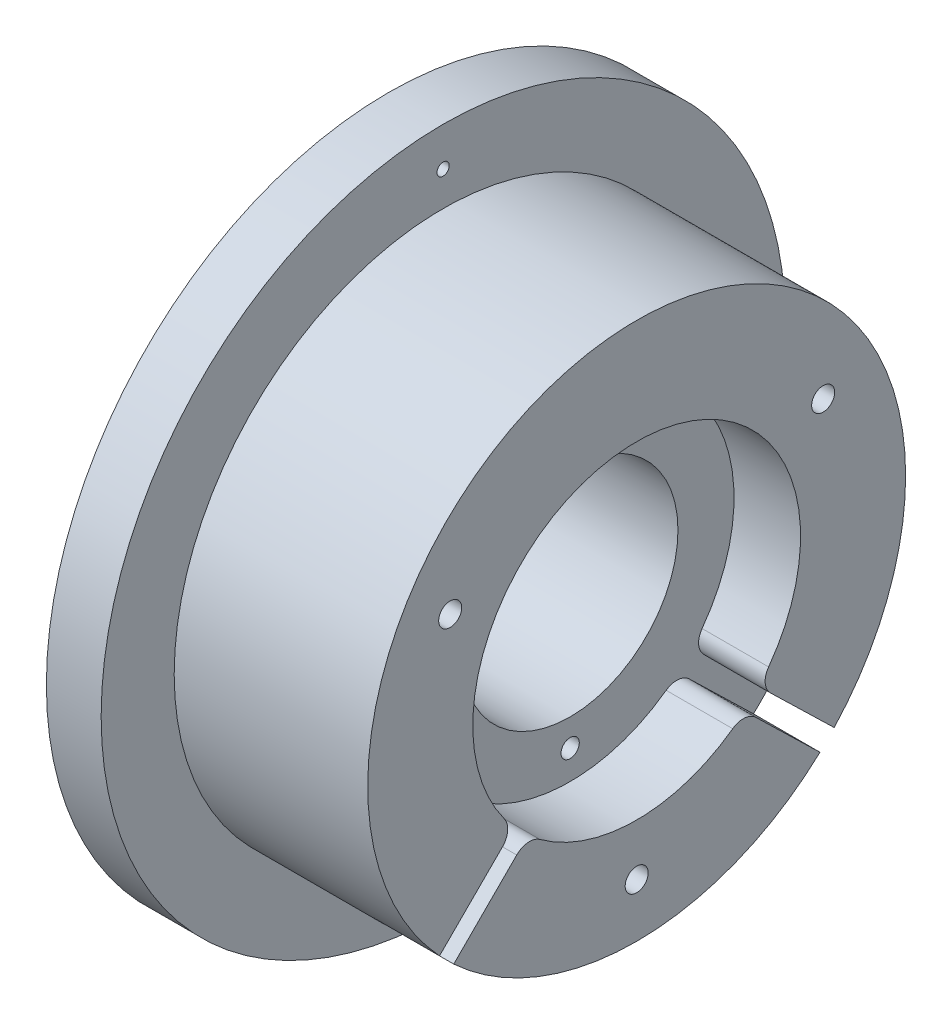
ISO-10303-21;
HEADER;
FILE_DESCRIPTION(('STEP AP214'),'2;1');
FILE_NAME('part.step','',(''),(''),'','','');
FILE_SCHEMA(('AUTOMOTIVE_DESIGN { 1 0 10303 214 1 1 1 1 }'));
ENDSEC;
DATA;
#1=APPLICATION_CONTEXT('core data for automotive mechanical design processes');
#2=APPLICATION_PROTOCOL_DEFINITION('international standard','automotive_design',2000,#1);
#3=PRODUCT_CONTEXT('',#1,'mechanical');
#4=PRODUCT('Part','Part','',(#3));
#5=PRODUCT_RELATED_PRODUCT_CATEGORY('part','',(#4));
#6=PRODUCT_DEFINITION_FORMATION('','',#4);
#7=PRODUCT_DEFINITION_CONTEXT('part definition',#1,'design');
#8=PRODUCT_DEFINITION('design','',#6,#7);
#9=PRODUCT_DEFINITION_SHAPE('','',#8);
#10=(LENGTH_UNIT() NAMED_UNIT(*) SI_UNIT(.MILLI.,.METRE.));
#11=(NAMED_UNIT(*) PLANE_ANGLE_UNIT() SI_UNIT($,.RADIAN.));
#12=(NAMED_UNIT(*) SI_UNIT($,.STERADIAN.) SOLID_ANGLE_UNIT());
#13=UNCERTAINTY_MEASURE_WITH_UNIT(LENGTH_MEASURE(1.E-05),#10,'distance_accuracy_value','');
#14=(GEOMETRIC_REPRESENTATION_CONTEXT(3) GLOBAL_UNCERTAINTY_ASSIGNED_CONTEXT((#13)) GLOBAL_UNIT_ASSIGNED_CONTEXT((#10,
#11,#12)) REPRESENTATION_CONTEXT('',''));
#15=CARTESIAN_POINT('',(0.,0.,0.));
#16=DIRECTION('',(0.,0.,1.));
#17=DIRECTION('',(1.,0.,0.));
#18=AXIS2_PLACEMENT_3D('',#15,#16,#17);
#19=CARTESIAN_POINT('',(17.272,0.,0.));
#20=DIRECTION('',(-1.,0.,0.));
#21=DIRECTION('',(0.,0.,1.));
#22=AXIS2_PLACEMENT_3D('',#19,#20,#21);
#23=PLANE('',#22);
#24=DIRECTION('',(0.,0.707106781186554,-0.707106781186541));
#25=VECTOR('',#24,1.);
#26=CARTESIAN_POINT('',(17.272,0.494974746830583,0.494974746830592));
#27=LINE('',#26,#25);
#28=CARTESIAN_POINT('',(17.272,-12.7236785584424,13.7136280521033));
#29=VERTEX_POINT('',#28);
#30=CARTESIAN_POINT('',(17.272,-8.34301144913065,9.33296094279167));
#31=VERTEX_POINT('',#30);
#32=EDGE_CURVE('E240',#29,#31,#27,.T.);
#33=ORIENTED_EDGE('',*,*,#32,.T.);
#34=CARTESIAN_POINT('',(17.272,-7.45912797264748,10.2168444192749));
#35=DIRECTION('',(-1.,0.,0.));
#36=DIRECTION('',(0.,0.,1.));
#37=AXIS2_PLACEMENT_3D('',#34,#35,#36);
#38=CIRCLE('',#37,1.25);
#39=CARTESIAN_POINT('',(17.272,-6.72205999116057,9.20727481262715));
#40=VERTEX_POINT('',#39);
#41=EDGE_CURVE('E285',#31,#40,#38,.F.);
#42=ORIENTED_EDGE('',*,*,#41,.T.);
#43=CARTESIAN_POINT('',(17.272,0.,0.));
#44=DIRECTION('',(1.,0.,0.));
#45=DIRECTION('',(0.,0.,-1.));
#46=AXIS2_PLACEMENT_3D('',#43,#44,#45);
#47=CIRCLE('',#46,11.4);
#48=CARTESIAN_POINT('',(17.272,-6.76336069546099,-9.17697946511233));
#49=VERTEX_POINT('',#48);
#50=EDGE_CURVE('E270',#49,#40,#47,.T.);
#51=ORIENTED_EDGE('',*,*,#50,.F.);
#52=CARTESIAN_POINT('',(17.272,-7.50495726294575,-10.1832272134799));
#53=DIRECTION('',(-1.,0.,0.));
#54=DIRECTION('',(0.,0.,1.));
#55=AXIS2_PLACEMENT_3D('',#52,#53,#54);
#56=CIRCLE('',#55,1.25);
#57=CARTESIAN_POINT('',(17.272,-8.40204130899871,-9.31274446562257));
#58=VERTEX_POINT('',#57);
#59=EDGE_CURVE('E283',#49,#58,#56,.F.);
#60=ORIENTED_EDGE('',*,*,#59,.T.);
#61=DIRECTION('',(0.,-0.696386198285868,-0.717667236842365));
#62=VECTOR('',#61,1.);
#63=CARTESIAN_POINT('',(17.272,0.326823466436906,-0.317132146514021));
#64=LINE('',#63,#62);
#65=CARTESIAN_POINT('',(17.272,-12.6966821527148,-13.7386263040718));
#66=VERTEX_POINT('',#65);
#67=EDGE_CURVE('E218',#58,#66,#64,.T.);
#68=ORIENTED_EDGE('',*,*,#67,.T.);
#69=CARTESIAN_POINT('',(17.272,0.,0.));
#70=DIRECTION('',(1.,0.,0.));
#71=DIRECTION('',(0.,0.,-1.));
#72=AXIS2_PLACEMENT_3D('',#69,#70,#71);
#73=CIRCLE('',#72,18.7071);
#74=EDGE_CURVE('E266',#66,#29,#73,.T.);
#75=ORIENTED_EDGE('',*,*,#74,.T.);
#76=EDGE_LOOP('',(#33,#42,#51,#60,#68,#75));
#77=FACE_BOUND('',#76,.T.);
#78=CARTESIAN_POINT('',(17.272,7.48875000000001,-12.9708954851814));
#79=DIRECTION('',(1.,0.,0.));
#80=DIRECTION('',(0.,0.,-1.));
#81=AXIS2_PLACEMENT_3D('',#78,#79,#80);
#82=CIRCLE('',#81,0.79999999999999);
#83=CARTESIAN_POINT('',(17.272,7.48875000000001,-13.7708954851814));
#84=VERTEX_POINT('',#83);
#85=EDGE_CURVE('E182',#84,#84,#82,.T.);
#86=ORIENTED_EDGE('',*,*,#85,.F.);
#87=EDGE_LOOP('',(#86));
#88=FACE_BOUND('',#87,.T.);
#89=CARTESIAN_POINT('',(17.272,7.48875,12.9708954851814));
#90=DIRECTION('',(1.,0.,0.));
#91=DIRECTION('',(0.,0.,-1.));
#92=AXIS2_PLACEMENT_3D('',#89,#90,#91);
#93=CIRCLE('',#92,0.79999999999999);
#94=CARTESIAN_POINT('',(17.272,7.48875,12.1708954851814));
#95=VERTEX_POINT('',#94);
#96=EDGE_CURVE('E183',#95,#95,#93,.T.);
#97=ORIENTED_EDGE('',*,*,#96,.F.);
#98=EDGE_LOOP('',(#97));
#99=FACE_BOUND('',#98,.T.);
#100=ADVANCED_FACE('F77',(#77,#88,#99),#23,.F.);
#101=CARTESIAN_POINT('',(17.272,-9.20727481262726,6.72205999116041));
#102=VERTEX_POINT('',#101);
#103=CARTESIAN_POINT('',(17.272,-9.23778357344644,-6.68007145546835));
#104=VERTEX_POINT('',#103);
#105=EDGE_CURVE('E271',#102,#104,#47,.T.);
#106=ORIENTED_EDGE('',*,*,#105,.F.);
#107=CARTESIAN_POINT('',(17.272,-10.216844419275,7.4591279726473));
#108=DIRECTION('',(-1.,0.,0.));
#109=DIRECTION('',(0.,0.,1.));
#110=AXIS2_PLACEMENT_3D('',#107,#108,#109);
#111=CIRCLE('',#110,1.25);
#112=CARTESIAN_POINT('',(17.272,-9.33296094279181,8.34301144913049));
#113=VERTEX_POINT('',#112);
#114=EDGE_CURVE('E300',#102,#113,#111,.F.);
#115=ORIENTED_EDGE('',*,*,#114,.T.);
#116=DIRECTION('',(0.,-0.707106781186553,0.707106781186542));
#117=VECTOR('',#116,1.);
#118=CARTESIAN_POINT('',(17.272,-0.494974746830585,-0.494974746830593));
#119=LINE('',#118,#117);
#120=CARTESIAN_POINT('',(17.272,-13.7136280521035,12.7236785584421));
#121=VERTEX_POINT('',#120);
#122=EDGE_CURVE('E236',#113,#121,#119,.T.);
#123=ORIENTED_EDGE('',*,*,#122,.T.);
#124=CARTESIAN_POINT('',(17.272,-13.6886585047887,-12.7505379788179));
#125=VERTEX_POINT('',#124);
#126=EDGE_CURVE('E267',#121,#125,#73,.T.);
#127=ORIENTED_EDGE('',*,*,#126,.T.);
#128=DIRECTION('',(0.,0.696386198285868,0.717667236842366));
#129=VECTOR('',#128,1.);
#130=CARTESIAN_POINT('',(17.272,-0.677910665142419,0.657808531086206));
#131=LINE('',#130,#129);
#132=CARTESIAN_POINT('',(17.272,-9.35361439290297,-8.28301817870599));
#133=VERTEX_POINT('',#132);
#134=EDGE_CURVE('E222',#125,#133,#131,.T.);
#135=ORIENTED_EDGE('',*,*,#134,.T.);
#136=CARTESIAN_POINT('',(17.272,-10.2506984389559,-7.41253543084865));
#137=DIRECTION('',(-1.,0.,0.));
#138=DIRECTION('',(0.,0.,1.));
#139=AXIS2_PLACEMENT_3D('',#136,#137,#138);
#140=CIRCLE('',#139,1.25);
#141=EDGE_CURVE('E298',#133,#104,#140,.F.);
#142=ORIENTED_EDGE('',*,*,#141,.T.);
#143=EDGE_LOOP('',(#106,#115,#123,#127,#135,#142));
#144=FACE_BOUND('',#143,.T.);
#145=CARTESIAN_POINT('',(17.272,-14.9775,0.));
#146=DIRECTION('',(1.,0.,0.));
#147=DIRECTION('',(0.,0.,-1.));
#148=AXIS2_PLACEMENT_3D('',#145,#146,#147);
#149=CIRCLE('',#148,0.79999999999999);
#150=CARTESIAN_POINT('',(17.272,-14.9775,-0.799999999999992));
#151=VERTEX_POINT('',#150);
#152=EDGE_CURVE('E193',#151,#151,#149,.T.);
#153=ORIENTED_EDGE('',*,*,#152,.F.);
#154=EDGE_LOOP('',(#153));
#155=FACE_BOUND('',#154,.T.);
#156=ADVANCED_FACE('F324',(#144,#155),#23,.F.);
#157=CARTESIAN_POINT('',(12.645,0.,0.));
#158=DIRECTION('',(1.,0.,0.));
#159=DIRECTION('',(0.,0.,-1.));
#160=AXIS2_PLACEMENT_3D('',#157,#158,#159);
#161=CYLINDRICAL_SURFACE('',#160,11.4);
#162=ORIENTED_EDGE('',*,*,#50,.T.);
#163=DIRECTION('',(1.,0.,0.));
#164=VECTOR('',#163,1.);
#165=CARTESIAN_POINT('',(12.645,-6.72205999116058,9.20727481262715));
#166=LINE('',#165,#164);
#167=CARTESIAN_POINT('',(12.645,-6.72205999116057,9.20727481262715));
#168=VERTEX_POINT('',#167);
#169=EDGE_CURVE('E289',#40,#168,#166,.F.);
#170=ORIENTED_EDGE('',*,*,#169,.T.);
#171=CARTESIAN_POINT('',(12.645,0.,0.));
#172=DIRECTION('',(1.,0.,0.));
#173=DIRECTION('',(0.,0.,-1.));
#174=AXIS2_PLACEMENT_3D('',#171,#172,#173);
#175=CIRCLE('',#174,11.4);
#176=CARTESIAN_POINT('',(12.645,-6.76336069546099,-9.17697946511233));
#177=VERTEX_POINT('',#176);
#178=EDGE_CURVE('E274',#177,#168,#175,.T.);
#179=ORIENTED_EDGE('',*,*,#178,.F.);
#180=DIRECTION('',(1.,0.,0.));
#181=VECTOR('',#180,1.);
#182=CARTESIAN_POINT('',(12.645,-6.76336069546099,-9.17697946511233));
#183=LINE('',#182,#181);
#184=EDGE_CURVE('E287',#177,#49,#183,.T.);
#185=ORIENTED_EDGE('',*,*,#184,.T.);
#186=EDGE_LOOP('',(#162,#170,#179,#185));
#187=FACE_BOUND('',#186,.T.);
#188=ADVANCED_FACE('F355',(#187),#161,.F.);
#189=CARTESIAN_POINT('',(12.645,-9.20727481262726,6.72205999116041));
#190=VERTEX_POINT('',#189);
#191=CARTESIAN_POINT('',(12.645,-9.23778357344644,-6.68007145546835));
#192=VERTEX_POINT('',#191);
#193=EDGE_CURVE('E275',#190,#192,#175,.T.);
#194=ORIENTED_EDGE('',*,*,#193,.F.);
#195=DIRECTION('',(1.,0.,0.));
#196=VECTOR('',#195,1.);
#197=CARTESIAN_POINT('',(12.645,-9.20727481262727,6.72205999116041));
#198=LINE('',#197,#196);
#199=EDGE_CURVE('E296',#190,#102,#198,.T.);
#200=ORIENTED_EDGE('',*,*,#199,.T.);
#201=ORIENTED_EDGE('',*,*,#105,.T.);
#202=DIRECTION('',(1.,0.,0.));
#203=VECTOR('',#202,1.);
#204=CARTESIAN_POINT('',(12.645,-9.23778357344644,-6.68007145546835));
#205=LINE('',#204,#203);
#206=EDGE_CURVE('E294',#104,#192,#205,.F.);
#207=ORIENTED_EDGE('',*,*,#206,.T.);
#208=EDGE_LOOP('',(#194,#200,#201,#207));
#209=FACE_BOUND('',#208,.T.);
#210=ADVANCED_FACE('F317',(#209),#161,.F.);
#211=CARTESIAN_POINT('',(12.645,0.,0.));
#212=DIRECTION('',(1.,0.,0.));
#213=DIRECTION('',(0.,0.,-1.));
#214=AXIS2_PLACEMENT_3D('',#211,#212,#213);
#215=CYLINDRICAL_SURFACE('',#214,18.7071);
#216=CARTESIAN_POINT('',(3.81,0.,0.));
#217=DIRECTION('',(1.,0.,0.));
#218=DIRECTION('',(0.,0.,-1.));
#219=AXIS2_PLACEMENT_3D('',#216,#217,#218);
#220=CIRCLE('',#219,18.7071);
#221=CARTESIAN_POINT('',(3.81,0.,-18.7071));
#222=VERTEX_POINT('',#221);
#223=EDGE_CURVE('E263',#222,#222,#220,.T.);
#224=ORIENTED_EDGE('',*,*,#223,.T.);
#225=EDGE_LOOP('',(#224));
#226=FACE_BOUND('',#225,.T.);
#227=DIRECTION('',(1.,0.,0.));
#228=VECTOR('',#227,1.);
#229=CARTESIAN_POINT('',(-7.10210074540848,-12.6966821527148,-13.7386263040718));
#230=LINE('',#229,#228);
#231=CARTESIAN_POINT('',(12.645,-12.6966821527148,-13.7386263040718));
#232=VERTEX_POINT('',#231);
#233=EDGE_CURVE('E221',#232,#66,#230,.T.);
#234=ORIENTED_EDGE('',*,*,#233,.F.);
#235=CARTESIAN_POINT('',(12.645,0.,0.));
#236=DIRECTION('',(-1.,0.,0.));
#237=DIRECTION('',(0.,0.,1.));
#238=AXIS2_PLACEMENT_3D('',#235,#236,#237);
#239=CIRCLE('',#238,18.7071);
#240=CARTESIAN_POINT('',(12.645,-13.6886585047887,-12.7505379788179));
#241=VERTEX_POINT('',#240);
#242=EDGE_CURVE('E226',#241,#232,#239,.F.);
#243=ORIENTED_EDGE('',*,*,#242,.F.);
#244=DIRECTION('',(1.,0.,0.));
#245=VECTOR('',#244,1.);
#246=CARTESIAN_POINT('',(-7.10210074540848,-13.6886585047887,-12.7505379788179));
#247=LINE('',#246,#245);
#248=EDGE_CURVE('E220',#241,#125,#247,.T.);
#249=ORIENTED_EDGE('',*,*,#248,.T.);
#250=ORIENTED_EDGE('',*,*,#126,.F.);
#251=DIRECTION('',(1.,0.,0.));
#252=VECTOR('',#251,1.);
#253=CARTESIAN_POINT('',(-7.10210074540848,-13.7136280521035,12.7236785584421));
#254=LINE('',#253,#252);
#255=CARTESIAN_POINT('',(12.645,-13.7136280521035,12.7236785584421));
#256=VERTEX_POINT('',#255);
#257=EDGE_CURVE('E239',#256,#121,#254,.T.);
#258=ORIENTED_EDGE('',*,*,#257,.F.);
#259=CARTESIAN_POINT('',(12.645,0.,0.));
#260=DIRECTION('',(-1.,0.,0.));
#261=DIRECTION('',(0.,0.,1.));
#262=AXIS2_PLACEMENT_3D('',#259,#260,#261);
#263=CIRCLE('',#262,18.7071);
#264=CARTESIAN_POINT('',(12.645,-12.7236785584424,13.7136280521033));
#265=VERTEX_POINT('',#264);
#266=EDGE_CURVE('E243',#265,#256,#263,.F.);
#267=ORIENTED_EDGE('',*,*,#266,.F.);
#268=DIRECTION('',(1.,0.,0.));
#269=VECTOR('',#268,1.);
#270=CARTESIAN_POINT('',(-7.10210074540848,-12.7236785584424,13.7136280521033));
#271=LINE('',#270,#269);
#272=EDGE_CURVE('E244',#265,#29,#271,.T.);
#273=ORIENTED_EDGE('',*,*,#272,.T.);
#274=ORIENTED_EDGE('',*,*,#74,.F.);
#275=EDGE_LOOP('',(#234,#243,#249,#250,#258,#267,#273,#274));
#276=FACE_BOUND('',#275,.T.);
#277=ADVANCED_FACE('F333',(#226,#276),#215,.T.);
#278=CARTESIAN_POINT('',(12.645,0.,0.));
#279=DIRECTION('',(1.,0.,0.));
#280=DIRECTION('',(0.,0.,-1.));
#281=AXIS2_PLACEMENT_3D('',#278,#279,#280);
#282=CYLINDRICAL_SURFACE('',#281,7.5);
#283=CARTESIAN_POINT('',(0.,0.,0.));
#284=DIRECTION('',(1.,0.,0.));
#285=DIRECTION('',(0.,0.,-1.));
#286=AXIS2_PLACEMENT_3D('',#283,#284,#285);
#287=CIRCLE('',#286,7.5);
#288=CARTESIAN_POINT('',(0.,0.,-7.5));
#289=VERTEX_POINT('',#288);
#290=EDGE_CURVE('E238',#289,#289,#287,.T.);
#291=ORIENTED_EDGE('',*,*,#290,.F.);
#292=EDGE_LOOP('',(#291));
#293=FACE_BOUND('',#292,.T.);
#294=CARTESIAN_POINT('',(12.645,0.,0.));
#295=DIRECTION('',(1.,0.,0.));
#296=DIRECTION('',(0.,0.,-1.));
#297=AXIS2_PLACEMENT_3D('',#294,#295,#296);
#298=CIRCLE('',#297,7.5);
#299=CARTESIAN_POINT('',(12.645,0.,-7.5));
#300=VERTEX_POINT('',#299);
#301=EDGE_CURVE('E277',#300,#300,#298,.T.);
#302=ORIENTED_EDGE('',*,*,#301,.T.);
#303=EDGE_LOOP('',(#302));
#304=FACE_BOUND('',#303,.T.);
#305=ADVANCED_FACE('F366',(#293,#304),#282,.F.);
#306=CARTESIAN_POINT('',(12.645,0.,0.));
#307=DIRECTION('',(-1.,0.,0.));
#308=DIRECTION('',(0.,0.,1.));
#309=AXIS2_PLACEMENT_3D('',#306,#307,#308);
#310=PLANE('',#309);
#311=CARTESIAN_POINT('',(12.645,9.375,0.));
#312=DIRECTION('',(1.,0.,0.));
#313=DIRECTION('',(0.,1.,0.));
#314=AXIS2_PLACEMENT_3D('',#311,#312,#313);
#315=CIRCLE('',#314,0.635);
#316=CARTESIAN_POINT('',(12.645,10.01,0.));
#317=VERTEX_POINT('',#316);
#318=EDGE_CURVE('E204',#317,#317,#315,.T.);
#319=ORIENTED_EDGE('',*,*,#318,.F.);
#320=EDGE_LOOP('',(#319));
#321=FACE_BOUND('',#320,.T.);
#322=CARTESIAN_POINT('',(12.645,-9.375,0.));
#323=DIRECTION('',(1.,0.,0.));
#324=DIRECTION('',(0.,1.,0.));
#325=AXIS2_PLACEMENT_3D('',#322,#323,#324);
#326=CIRCLE('',#325,0.635);
#327=CARTESIAN_POINT('',(12.645,-8.74,0.));
#328=VERTEX_POINT('',#327);
#329=EDGE_CURVE('E199',#328,#328,#326,.T.);
#330=ORIENTED_EDGE('',*,*,#329,.F.);
#331=EDGE_LOOP('',(#330));
#332=FACE_BOUND('',#331,.T.);
#333=ORIENTED_EDGE('',*,*,#301,.F.);
#334=EDGE_LOOP('',(#333));
#335=FACE_BOUND('',#334,.T.);
#336=DIRECTION('',(0.,-0.707106781186553,0.707106781186542));
#337=VECTOR('',#336,1.);
#338=CARTESIAN_POINT('',(12.645,-0.494974746830585,-0.494974746830594));
#339=LINE('',#338,#337);
#340=CARTESIAN_POINT('',(12.645,-9.33296094279181,8.34301144913049));
#341=VERTEX_POINT('',#340);
#342=EDGE_CURVE('E225',#341,#256,#339,.T.);
#343=ORIENTED_EDGE('',*,*,#342,.F.);
#344=CARTESIAN_POINT('',(12.645,-10.216844419275,7.4591279726473));
#345=DIRECTION('',(-1.,0.,0.));
#346=DIRECTION('',(0.,0.,1.));
#347=AXIS2_PLACEMENT_3D('',#344,#345,#346);
#348=CIRCLE('',#347,1.25);
#349=EDGE_CURVE('E309',#341,#190,#348,.T.);
#350=ORIENTED_EDGE('',*,*,#349,.T.);
#351=ORIENTED_EDGE('',*,*,#193,.T.);
#352=CARTESIAN_POINT('',(12.645,-10.2506984389559,-7.41253543084865));
#353=DIRECTION('',(-1.,0.,0.));
#354=DIRECTION('',(0.,0.,1.));
#355=AXIS2_PLACEMENT_3D('',#352,#353,#354);
#356=CIRCLE('',#355,1.25);
#357=CARTESIAN_POINT('',(12.645,-9.35361439290297,-8.28301817870599));
#358=VERTEX_POINT('',#357);
#359=EDGE_CURVE('E85',#192,#358,#356,.T.);
#360=ORIENTED_EDGE('',*,*,#359,.T.);
#361=DIRECTION('',(0.,0.696386198285868,0.717667236842366));
#362=VECTOR('',#361,1.);
#363=CARTESIAN_POINT('',(12.645,-0.677910665142419,0.657808531086206));
#364=LINE('',#363,#362);
#365=EDGE_CURVE('E215',#241,#358,#364,.T.);
#366=ORIENTED_EDGE('',*,*,#365,.F.);
#367=ORIENTED_EDGE('',*,*,#242,.T.);
#368=DIRECTION('',(0.,-0.696386198285868,-0.717667236842365));
#369=VECTOR('',#368,1.);
#370=CARTESIAN_POINT('',(12.645,0.326823466436906,-0.317132146514021));
#371=LINE('',#370,#369);
#372=CARTESIAN_POINT('',(12.645,-8.40204130899871,-9.31274446562258));
#373=VERTEX_POINT('',#372);
#374=EDGE_CURVE('E229',#373,#232,#371,.T.);
#375=ORIENTED_EDGE('',*,*,#374,.F.);
#376=CARTESIAN_POINT('',(12.645,-7.50495726294575,-10.1832272134799));
#377=DIRECTION('',(-1.,0.,0.));
#378=DIRECTION('',(0.,0.,1.));
#379=AXIS2_PLACEMENT_3D('',#376,#377,#378);
#380=CIRCLE('',#379,1.25);
#381=EDGE_CURVE('E12',#373,#177,#380,.T.);
#382=ORIENTED_EDGE('',*,*,#381,.T.);
#383=ORIENTED_EDGE('',*,*,#178,.T.);
#384=CARTESIAN_POINT('',(12.645,-7.45912797264748,10.2168444192749));
#385=DIRECTION('',(-1.,0.,0.));
#386=DIRECTION('',(0.,0.,1.));
#387=AXIS2_PLACEMENT_3D('',#384,#385,#386);
#388=CIRCLE('',#387,1.25);
#389=CARTESIAN_POINT('',(12.645,-8.34301144913066,9.33296094279167));
#390=VERTEX_POINT('',#389);
#391=EDGE_CURVE('E307',#168,#390,#388,.T.);
#392=ORIENTED_EDGE('',*,*,#391,.T.);
#393=DIRECTION('',(0.,0.707106781186554,-0.707106781186541));
#394=VECTOR('',#393,1.);
#395=CARTESIAN_POINT('',(12.645,0.494974746830584,0.494974746830592));
#396=LINE('',#395,#394);
#397=EDGE_CURVE('E246',#265,#390,#396,.T.);
#398=ORIENTED_EDGE('',*,*,#397,.F.);
#399=ORIENTED_EDGE('',*,*,#266,.T.);
#400=EDGE_LOOP('',(#343,#350,#351,#360,#366,#367,#375,#382,#383,#392,#398,#399));
#401=FACE_BOUND('',#400,.T.);
#402=ADVANCED_FACE('F312',(#321,#332,#335,#401),#310,.F.);
#403=CARTESIAN_POINT('',(3.81,0.,0.));
#404=DIRECTION('',(-1.,0.,0.));
#405=DIRECTION('',(0.,0.,1.));
#406=AXIS2_PLACEMENT_3D('',#403,#404,#405);
#407=PLANE('',#406);
#408=CARTESIAN_POINT('',(3.81,21.082,0.));
#409=DIRECTION('',(1.,0.,0.));
#410=DIRECTION('',(0.,1.,0.));
#411=AXIS2_PLACEMENT_3D('',#408,#409,#410);
#412=CIRCLE('',#411,0.425000000000001);
#413=CARTESIAN_POINT('',(3.81,21.507,0.));
#414=VERTEX_POINT('',#413);
#415=EDGE_CURVE('E203',#414,#414,#412,.T.);
#416=ORIENTED_EDGE('',*,*,#415,.F.);
#417=EDGE_LOOP('',(#416));
#418=FACE_BOUND('',#417,.T.);
#419=ORIENTED_EDGE('',*,*,#223,.F.);
#420=EDGE_LOOP('',(#419));
#421=FACE_BOUND('',#420,.T.);
#422=CARTESIAN_POINT('',(3.81,0.,0.));
#423=DIRECTION('',(1.,0.,0.));
#424=DIRECTION('',(0.,0.,-1.));
#425=AXIS2_PLACEMENT_3D('',#422,#423,#424);
#426=CIRCLE('',#425,23.7871);
#427=CARTESIAN_POINT('',(3.81,0.,-23.7871));
#428=VERTEX_POINT('',#427);
#429=EDGE_CURVE('E260',#428,#428,#426,.T.);
#430=ORIENTED_EDGE('',*,*,#429,.T.);
#431=EDGE_LOOP('',(#430));
#432=FACE_BOUND('',#431,.T.);
#433=ADVANCED_FACE('F365',(#418,#421,#432),#407,.F.);
#434=CARTESIAN_POINT('',(12.645,0.,0.));
#435=DIRECTION('',(1.,0.,0.));
#436=DIRECTION('',(0.,0.,-1.));
#437=AXIS2_PLACEMENT_3D('',#434,#435,#436);
#438=CYLINDRICAL_SURFACE('',#437,23.7871);
#439=ORIENTED_EDGE('',*,*,#429,.F.);
#440=EDGE_LOOP('',(#439));
#441=FACE_BOUND('',#440,.T.);
#442=CARTESIAN_POINT('',(0.,0.,0.));
#443=DIRECTION('',(1.,0.,0.));
#444=DIRECTION('',(0.,0.,-1.));
#445=AXIS2_PLACEMENT_3D('',#442,#443,#444);
#446=CIRCLE('',#445,23.7871);
#447=CARTESIAN_POINT('',(0.,0.,-23.7871));
#448=VERTEX_POINT('',#447);
#449=EDGE_CURVE('E257',#448,#448,#446,.T.);
#450=ORIENTED_EDGE('',*,*,#449,.T.);
#451=EDGE_LOOP('',(#450));
#452=FACE_BOUND('',#451,.T.);
#453=ADVANCED_FACE('F413',(#441,#452),#438,.T.);
#454=CARTESIAN_POINT('',(0.,0.,0.));
#455=DIRECTION('',(1.,0.,0.));
#456=DIRECTION('',(0.,0.,-1.));
#457=AXIS2_PLACEMENT_3D('',#454,#455,#456);
#458=PLANE('',#457);
#459=CARTESIAN_POINT('',(0.,9.375,0.));
#460=DIRECTION('',(1.,0.,0.));
#461=DIRECTION('',(0.,1.,0.));
#462=AXIS2_PLACEMENT_3D('',#459,#460,#461);
#463=CIRCLE('',#462,0.635);
#464=CARTESIAN_POINT('',(0.,10.01,0.));
#465=VERTEX_POINT('',#464);
#466=EDGE_CURVE('E200',#465,#465,#463,.T.);
#467=ORIENTED_EDGE('',*,*,#466,.T.);
#468=EDGE_LOOP('',(#467));
#469=FACE_BOUND('',#468,.T.);
#470=CARTESIAN_POINT('',(0.,-9.375,0.));
#471=DIRECTION('',(1.,0.,0.));
#472=DIRECTION('',(0.,1.,0.));
#473=AXIS2_PLACEMENT_3D('',#470,#471,#472);
#474=CIRCLE('',#473,0.635);
#475=CARTESIAN_POINT('',(0.,-8.74,0.));
#476=VERTEX_POINT('',#475);
#477=EDGE_CURVE('E207',#476,#476,#474,.T.);
#478=ORIENTED_EDGE('',*,*,#477,.T.);
#479=EDGE_LOOP('',(#478));
#480=FACE_BOUND('',#479,.T.);
#481=CARTESIAN_POINT('',(0.,21.082,0.));
#482=DIRECTION('',(1.,0.,0.));
#483=DIRECTION('',(0.,1.,0.));
#484=AXIS2_PLACEMENT_3D('',#481,#482,#483);
#485=CIRCLE('',#484,0.425000000000001);
#486=CARTESIAN_POINT('',(0.,21.507,0.));
#487=VERTEX_POINT('',#486);
#488=EDGE_CURVE('E212',#487,#487,#485,.T.);
#489=ORIENTED_EDGE('',*,*,#488,.T.);
#490=EDGE_LOOP('',(#489));
#491=FACE_BOUND('',#490,.T.);
#492=ORIENTED_EDGE('',*,*,#449,.F.);
#493=EDGE_LOOP('',(#492));
#494=FACE_BOUND('',#493,.T.);
#495=ORIENTED_EDGE('',*,*,#290,.T.);
#496=EDGE_LOOP('',(#495));
#497=FACE_BOUND('',#496,.T.);
#498=ADVANCED_FACE('F410',(#469,#480,#491,#494,#497),#458,.F.);
#499=CARTESIAN_POINT('',(-7.10210074540848,0.494974746830584,0.494974746830592));
#500=DIRECTION('',(0.,-0.707106781186541,-0.707106781186554));
#501=DIRECTION('',(0.,0.707106781186554,-0.707106781186541));
#502=AXIS2_PLACEMENT_3D('',#499,#500,#501);
#503=PLANE('',#502);
#504=ORIENTED_EDGE('',*,*,#397,.T.);
#505=DIRECTION('',(-1.,0.,0.));
#506=VECTOR('',#505,1.);
#507=CARTESIAN_POINT('',(17.272,-8.34301144913066,9.33296094279167));
#508=LINE('',#507,#506);
#509=EDGE_CURVE('E280',#390,#31,#508,.F.);
#510=ORIENTED_EDGE('',*,*,#509,.T.);
#511=ORIENTED_EDGE('',*,*,#32,.F.);
#512=ORIENTED_EDGE('',*,*,#272,.F.);
#513=EDGE_LOOP('',(#504,#510,#511,#512));
#514=FACE_BOUND('',#513,.T.);
#515=ADVANCED_FACE('F387',(#514),#503,.T.);
#516=CARTESIAN_POINT('',(-7.10210074540848,-0.494974746830585,-0.494974746830593));
#517=DIRECTION('',(0.,0.707106781186542,0.707106781186553));
#518=DIRECTION('',(0.,-0.707106781186553,0.707106781186542));
#519=AXIS2_PLACEMENT_3D('',#516,#517,#518);
#520=PLANE('',#519);
#521=ORIENTED_EDGE('',*,*,#122,.F.);
#522=DIRECTION('',(-1.,0.,0.));
#523=VECTOR('',#522,1.);
#524=CARTESIAN_POINT('',(12.645,-9.33296094279181,8.34301144913049));
#525=LINE('',#524,#523);
#526=EDGE_CURVE('E291',#113,#341,#525,.T.);
#527=ORIENTED_EDGE('',*,*,#526,.T.);
#528=ORIENTED_EDGE('',*,*,#342,.T.);
#529=ORIENTED_EDGE('',*,*,#257,.T.);
#530=EDGE_LOOP('',(#521,#527,#528,#529));
#531=FACE_BOUND('',#530,.T.);
#532=ADVANCED_FACE('F327',(#531),#520,.T.);
#533=CARTESIAN_POINT('',(-7.10210074540848,0.326823466436906,-0.317132146514021));
#534=DIRECTION('',(0.,-0.717667236842365,0.696386198285868));
#535=DIRECTION('',(0.,-0.696386198285868,-0.717667236842365));
#536=AXIS2_PLACEMENT_3D('',#533,#534,#535);
#537=PLANE('',#536);
#538=ORIENTED_EDGE('',*,*,#67,.F.);
#539=DIRECTION('',(-1.,0.,0.));
#540=VECTOR('',#539,1.);
#541=CARTESIAN_POINT('',(12.645,-8.40204130899871,-9.31274446562257));
#542=LINE('',#541,#540);
#543=EDGE_CURVE('E305',#58,#373,#542,.T.);
#544=ORIENTED_EDGE('',*,*,#543,.T.);
#545=ORIENTED_EDGE('',*,*,#374,.T.);
#546=ORIENTED_EDGE('',*,*,#233,.T.);
#547=EDGE_LOOP('',(#538,#544,#545,#546));
#548=FACE_BOUND('',#547,.T.);
#549=ADVANCED_FACE('F394',(#548),#537,.T.);
#550=CARTESIAN_POINT('',(-7.10210074540848,-0.677910665142418,0.657808531086206));
#551=DIRECTION('',(0.,0.717667236842366,-0.696386198285868));
#552=DIRECTION('',(0.,0.696386198285868,0.717667236842366));
#553=AXIS2_PLACEMENT_3D('',#550,#551,#552);
#554=PLANE('',#553);
#555=ORIENTED_EDGE('',*,*,#365,.T.);
#556=DIRECTION('',(-1.,0.,0.));
#557=VECTOR('',#556,1.);
#558=CARTESIAN_POINT('',(17.272,-9.35361439290297,-8.28301817870598));
#559=LINE('',#558,#557);
#560=EDGE_CURVE('E302',#358,#133,#559,.F.);
#561=ORIENTED_EDGE('',*,*,#560,.T.);
#562=ORIENTED_EDGE('',*,*,#134,.F.);
#563=ORIENTED_EDGE('',*,*,#248,.F.);
#564=EDGE_LOOP('',(#555,#561,#562,#563));
#565=FACE_BOUND('',#564,.T.);
#566=ADVANCED_FACE('F337',(#565),#554,.T.);
#567=CARTESIAN_POINT('',(0.,21.082,0.));
#568=DIRECTION('',(1.,0.,0.));
#569=DIRECTION('',(0.,1.,0.));
#570=AXIS2_PLACEMENT_3D('',#567,#568,#569);
#571=CYLINDRICAL_SURFACE('',#570,0.425000000000001);
#572=ORIENTED_EDGE('',*,*,#488,.F.);
#573=EDGE_LOOP('',(#572));
#574=FACE_BOUND('',#573,.T.);
#575=ORIENTED_EDGE('',*,*,#415,.T.);
#576=EDGE_LOOP('',(#575));
#577=FACE_BOUND('',#576,.T.);
#578=ADVANCED_FACE('F403',(#574,#577),#571,.F.);
#579=CARTESIAN_POINT('',(0.,-9.375,0.));
#580=DIRECTION('',(1.,0.,0.));
#581=DIRECTION('',(0.,1.,0.));
#582=AXIS2_PLACEMENT_3D('',#579,#580,#581);
#583=CYLINDRICAL_SURFACE('',#582,0.635);
#584=ORIENTED_EDGE('',*,*,#477,.F.);
#585=EDGE_LOOP('',(#584));
#586=FACE_BOUND('',#585,.T.);
#587=ORIENTED_EDGE('',*,*,#329,.T.);
#588=EDGE_LOOP('',(#587));
#589=FACE_BOUND('',#588,.T.);
#590=ADVANCED_FACE('F377',(#586,#589),#583,.F.);
#591=CARTESIAN_POINT('',(0.,9.375,0.));
#592=DIRECTION('',(1.,0.,0.));
#593=DIRECTION('',(0.,1.,0.));
#594=AXIS2_PLACEMENT_3D('',#591,#592,#593);
#595=CYLINDRICAL_SURFACE('',#594,0.635);
#596=ORIENTED_EDGE('',*,*,#466,.F.);
#597=EDGE_LOOP('',(#596));
#598=FACE_BOUND('',#597,.T.);
#599=ORIENTED_EDGE('',*,*,#318,.T.);
#600=EDGE_LOOP('',(#599));
#601=FACE_BOUND('',#600,.T.);
#602=ADVANCED_FACE('F372',(#598,#601),#595,.F.);
#603=CARTESIAN_POINT('',(12.645,-7.45912797264748,10.2168444192749));
#604=DIRECTION('',(1.,0.,0.));
#605=DIRECTION('',(0.,0.,-1.));
#606=AXIS2_PLACEMENT_3D('',#603,#604,#605);
#607=CYLINDRICAL_SURFACE('',#606,1.25);
#608=ORIENTED_EDGE('',*,*,#391,.F.);
#609=ORIENTED_EDGE('',*,*,#169,.F.);
#610=ORIENTED_EDGE('',*,*,#41,.F.);
#611=ORIENTED_EDGE('',*,*,#509,.F.);
#612=EDGE_LOOP('',(#608,#609,#610,#611));
#613=FACE_BOUND('',#612,.T.);
#614=ADVANCED_FACE('F347',(#613),#607,.T.);
#615=CARTESIAN_POINT('',(12.645,-10.216844419275,7.4591279726473));
#616=DIRECTION('',(1.,0.,0.));
#617=DIRECTION('',(0.,0.,-1.));
#618=AXIS2_PLACEMENT_3D('',#615,#616,#617);
#619=CYLINDRICAL_SURFACE('',#618,1.25);
#620=ORIENTED_EDGE('',*,*,#114,.F.);
#621=ORIENTED_EDGE('',*,*,#199,.F.);
#622=ORIENTED_EDGE('',*,*,#349,.F.);
#623=ORIENTED_EDGE('',*,*,#526,.F.);
#624=EDGE_LOOP('',(#620,#621,#622,#623));
#625=FACE_BOUND('',#624,.T.);
#626=ADVANCED_FACE('F321',(#625),#619,.T.);
#627=CARTESIAN_POINT('',(12.645,-10.2506984389559,-7.41253543084865));
#628=DIRECTION('',(1.,0.,0.));
#629=DIRECTION('',(0.,0.,-1.));
#630=AXIS2_PLACEMENT_3D('',#627,#628,#629);
#631=CYLINDRICAL_SURFACE('',#630,1.25);
#632=ORIENTED_EDGE('',*,*,#359,.F.);
#633=ORIENTED_EDGE('',*,*,#206,.F.);
#634=ORIENTED_EDGE('',*,*,#141,.F.);
#635=ORIENTED_EDGE('',*,*,#560,.F.);
#636=EDGE_LOOP('',(#632,#633,#634,#635));
#637=FACE_BOUND('',#636,.T.);
#638=ADVANCED_FACE('F340',(#637),#631,.T.);
#639=CARTESIAN_POINT('',(12.645,-7.50495726294575,-10.1832272134799));
#640=DIRECTION('',(1.,0.,0.));
#641=DIRECTION('',(0.,0.,-1.));
#642=AXIS2_PLACEMENT_3D('',#639,#640,#641);
#643=CYLINDRICAL_SURFACE('',#642,1.25);
#644=ORIENTED_EDGE('',*,*,#59,.F.);
#645=ORIENTED_EDGE('',*,*,#184,.F.);
#646=ORIENTED_EDGE('',*,*,#381,.F.);
#647=ORIENTED_EDGE('',*,*,#543,.F.);
#648=EDGE_LOOP('',(#644,#645,#646,#647));
#649=FACE_BOUND('',#648,.T.);
#650=ADVANCED_FACE('F79',(#649),#643,.T.);
#651=CARTESIAN_POINT('',(10.922,-14.9775,0.));
#652=DIRECTION('',(1.,0.,0.));
#653=DIRECTION('',(0.,0.,-1.));
#654=AXIS2_PLACEMENT_3D('',#651,#652,#653);
#655=CONICAL_SURFACE('',#654,0.799999999999997,1.02974425867665);
#656=CARTESIAN_POINT('',(10.441311504778,-14.9775,0.));
#657=VERTEX_POINT('',#656);
#658=VERTEX_LOOP('',#657);
#659=FACE_BOUND('',#658,.T.);
#660=CARTESIAN_POINT('',(10.922,-14.9775,0.));
#661=DIRECTION('',(1.,0.,0.));
#662=DIRECTION('',(0.,0.,-1.));
#663=AXIS2_PLACEMENT_3D('',#660,#661,#662);
#664=CIRCLE('',#663,0.799999999999997);
#665=CARTESIAN_POINT('',(10.922,-14.9775,-0.799999999999999));
#666=VERTEX_POINT('',#665);
#667=EDGE_CURVE('E196',#666,#666,#664,.T.);
#668=ORIENTED_EDGE('',*,*,#667,.T.);
#669=EDGE_LOOP('',(#668));
#670=FACE_BOUND('',#669,.T.);
#671=ADVANCED_FACE('F346',(#659,#670),#655,.F.);
#672=CARTESIAN_POINT('',(17.272,-14.9775,0.));
#673=DIRECTION('',(1.,0.,0.));
#674=DIRECTION('',(0.,0.,-1.));
#675=AXIS2_PLACEMENT_3D('',#672,#673,#674);
#676=CYLINDRICAL_SURFACE('',#675,0.799999999999993);
#677=ORIENTED_EDGE('',*,*,#667,.F.);
#678=EDGE_LOOP('',(#677));
#679=FACE_BOUND('',#678,.T.);
#680=ORIENTED_EDGE('',*,*,#152,.T.);
#681=EDGE_LOOP('',(#680));
#682=FACE_BOUND('',#681,.T.);
#683=ADVANCED_FACE('F459',(#679,#682),#676,.F.);
#684=CARTESIAN_POINT('',(10.922,7.48875000000001,-12.9708954851814));
#685=DIRECTION('',(1.,0.,0.));
#686=DIRECTION('',(0.,0.,-1.));
#687=AXIS2_PLACEMENT_3D('',#684,#685,#686);
#688=CONICAL_SURFACE('',#687,0.799999999999997,1.02974425867665);
#689=CARTESIAN_POINT('',(10.441311504778,7.48875000000001,-12.9708954851814));
#690=VERTEX_POINT('',#689);
#691=VERTEX_LOOP('',#690);
#692=FACE_BOUND('',#691,.T.);
#693=CARTESIAN_POINT('',(10.922,7.48875000000001,-12.9708954851814));
#694=DIRECTION('',(1.,0.,0.));
#695=DIRECTION('',(0.,0.,-1.));
#696=AXIS2_PLACEMENT_3D('',#693,#694,#695);
#697=CIRCLE('',#696,0.799999999999997);
#698=CARTESIAN_POINT('',(10.922,7.48875000000001,-13.7708954851814));
#699=VERTEX_POINT('',#698);
#700=EDGE_CURVE('E186',#699,#699,#697,.T.);
#701=ORIENTED_EDGE('',*,*,#700,.T.);
#702=EDGE_LOOP('',(#701));
#703=FACE_BOUND('',#702,.T.);
#704=ADVANCED_FACE('F467',(#692,#703),#688,.F.);
#705=CARTESIAN_POINT('',(17.272,7.48875000000001,-12.9708954851814));
#706=DIRECTION('',(1.,0.,0.));
#707=DIRECTION('',(0.,0.,-1.));
#708=AXIS2_PLACEMENT_3D('',#705,#706,#707);
#709=CYLINDRICAL_SURFACE('',#708,0.799999999999993);
#710=ORIENTED_EDGE('',*,*,#700,.F.);
#711=EDGE_LOOP('',(#710));
#712=FACE_BOUND('',#711,.T.);
#713=ORIENTED_EDGE('',*,*,#85,.T.);
#714=EDGE_LOOP('',(#713));
#715=FACE_BOUND('',#714,.T.);
#716=ADVANCED_FACE('F176',(#712,#715),#709,.F.);
#717=CARTESIAN_POINT('',(10.922,7.48875,12.9708954851814));
#718=DIRECTION('',(1.,0.,0.));
#719=DIRECTION('',(0.,0.,-1.));
#720=AXIS2_PLACEMENT_3D('',#717,#718,#719);
#721=CONICAL_SURFACE('',#720,0.799999999999997,1.02974425867665);
#722=CARTESIAN_POINT('',(10.441311504778,7.48874999999999,12.9708954851814));
#723=VERTEX_POINT('',#722);
#724=VERTEX_LOOP('',#723);
#725=FACE_BOUND('',#724,.T.);
#726=CARTESIAN_POINT('',(10.922,7.48875,12.9708954851814));
#727=DIRECTION('',(1.,0.,0.));
#728=DIRECTION('',(0.,0.,-1.));
#729=AXIS2_PLACEMENT_3D('',#726,#727,#728);
#730=CIRCLE('',#729,0.799999999999997);
#731=CARTESIAN_POINT('',(10.922,7.48875,12.1708954851814));
#732=VERTEX_POINT('',#731);
#733=EDGE_CURVE('E180',#732,#732,#730,.T.);
#734=ORIENTED_EDGE('',*,*,#733,.T.);
#735=EDGE_LOOP('',(#734));
#736=FACE_BOUND('',#735,.T.);
#737=ADVANCED_FACE('F172',(#725,#736),#721,.F.);
#738=CARTESIAN_POINT('',(17.272,7.48875,12.9708954851814));
#739=DIRECTION('',(1.,0.,0.));
#740=DIRECTION('',(0.,0.,-1.));
#741=AXIS2_PLACEMENT_3D('',#738,#739,#740);
#742=CYLINDRICAL_SURFACE('',#741,0.799999999999993);
#743=ORIENTED_EDGE('',*,*,#733,.F.);
#744=EDGE_LOOP('',(#743));
#745=FACE_BOUND('',#744,.T.);
#746=ORIENTED_EDGE('',*,*,#96,.T.);
#747=EDGE_LOOP('',(#746));
#748=FACE_BOUND('',#747,.T.);
#749=ADVANCED_FACE('F175',(#745,#748),#742,.F.);
#750=CLOSED_SHELL('',(#100,#156,#188,#210,#277,#305,#402,#433,#453,#498,#515,#532,#549,#566,
#578,#590,#602,#614,#626,#638,#650,#671,#683,#704,#716,#737,#749));
#751=MANIFOLD_SOLID_BREP('B2',#750);
#752=ADVANCED_BREP_SHAPE_REPRESENTATION('',(#18,#751),#14);
#753=SHAPE_DEFINITION_REPRESENTATION(#9,#752);
ENDSEC;
END-ISO-10303-21;
